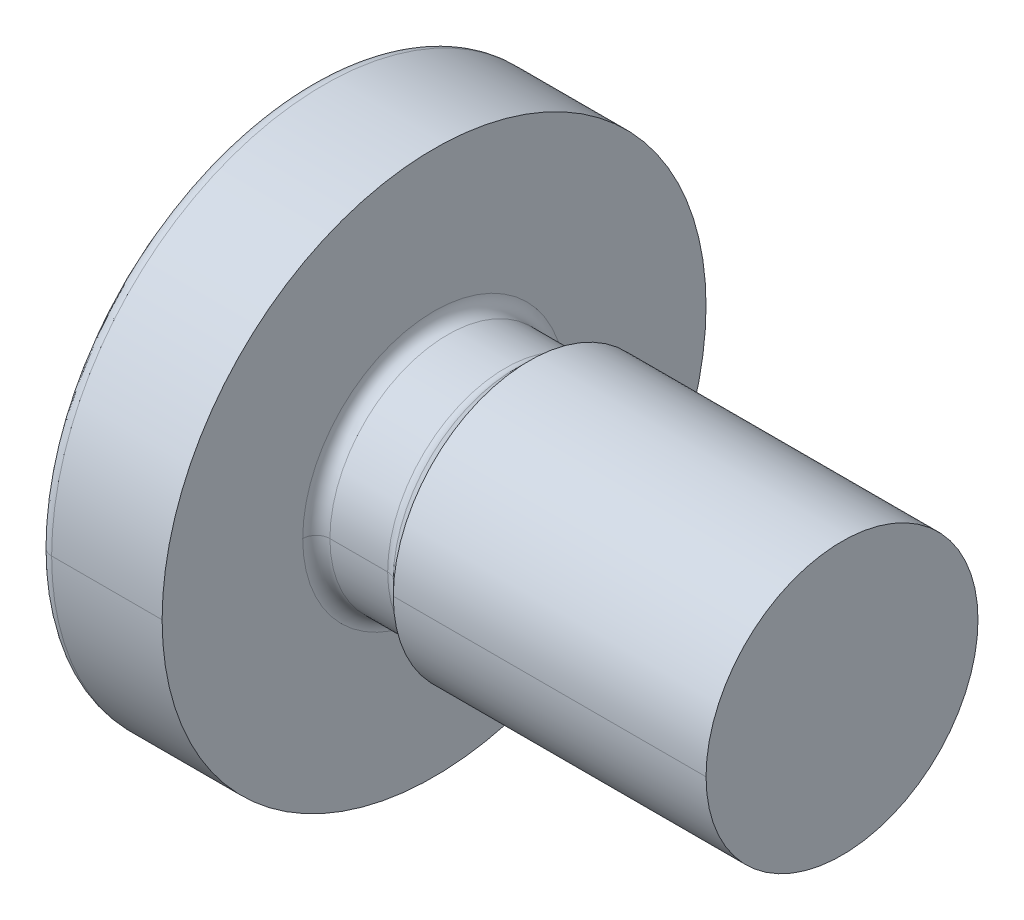
ISO-10303-21;
HEADER;
FILE_DESCRIPTION(('STEP AP214'),'2;1');
FILE_NAME('part.step','',(''),(''),'','','');
FILE_SCHEMA(('AUTOMOTIVE_DESIGN { 1 0 10303 214 1 1 1 1 }'));
ENDSEC;
DATA;
#1=APPLICATION_CONTEXT('core data for automotive mechanical design processes');
#2=APPLICATION_PROTOCOL_DEFINITION('international standard','automotive_design',2000,#1);
#3=PRODUCT_CONTEXT('',#1,'mechanical');
#4=PRODUCT('Part','Part','',(#3));
#5=PRODUCT_RELATED_PRODUCT_CATEGORY('part','',(#4));
#6=PRODUCT_DEFINITION_FORMATION('','',#4);
#7=PRODUCT_DEFINITION_CONTEXT('part definition',#1,'design');
#8=PRODUCT_DEFINITION('design','',#6,#7);
#9=PRODUCT_DEFINITION_SHAPE('','',#8);
#10=(LENGTH_UNIT() NAMED_UNIT(*) SI_UNIT(.MILLI.,.METRE.));
#11=(NAMED_UNIT(*) PLANE_ANGLE_UNIT() SI_UNIT($,.RADIAN.));
#12=(NAMED_UNIT(*) SI_UNIT($,.STERADIAN.) SOLID_ANGLE_UNIT());
#13=UNCERTAINTY_MEASURE_WITH_UNIT(LENGTH_MEASURE(1.E-05),#10,'distance_accuracy_value','');
#14=(GEOMETRIC_REPRESENTATION_CONTEXT(3) GLOBAL_UNCERTAINTY_ASSIGNED_CONTEXT((#13)) GLOBAL_UNIT_ASSIGNED_CONTEXT((#10,
#11,#12)) REPRESENTATION_CONTEXT('',''));
#15=CARTESIAN_POINT('',(0.,0.,0.));
#16=DIRECTION('',(0.,0.,1.));
#17=DIRECTION('',(1.,0.,0.));
#18=AXIS2_PLACEMENT_3D('',#15,#16,#17);
#19=CARTESIAN_POINT('',(3.3,0.,0.));
#20=DIRECTION('',(-1.,0.,0.));
#21=DIRECTION('',(0.,0.,1.));
#22=AXIS2_PLACEMENT_3D('',#19,#20,#21);
#23=TOROIDAL_SURFACE('',#22,1.932,0.2);
#24=CARTESIAN_POINT('',(3.1,0.,0.));
#25=DIRECTION('',(-1.,0.,0.));
#26=DIRECTION('',(0.,0.,1.));
#27=AXIS2_PLACEMENT_3D('',#24,#25,#26);
#28=CIRCLE('',#27,1.932);
#29=CARTESIAN_POINT('',(3.1,0.,-1.932));
#30=VERTEX_POINT('',#29);
#31=CARTESIAN_POINT('',(3.1,0.,1.932));
#32=VERTEX_POINT('',#31);
#33=EDGE_CURVE('E40',#30,#32,#28,.T.);
#34=ORIENTED_EDGE('',*,*,#33,.F.);
#35=CARTESIAN_POINT('',(3.3,0.,-1.932));
#36=DIRECTION('',(0.,1.,0.));
#37=DIRECTION('',(0.,0.,1.));
#38=AXIS2_PLACEMENT_3D('',#35,#36,#37);
#39=CIRCLE('',#38,0.2);
#40=CARTESIAN_POINT('',(3.3,0.,-1.732));
#41=VERTEX_POINT('',#40);
#42=EDGE_CURVE('E10',#30,#41,#39,.T.);
#43=ORIENTED_EDGE('',*,*,#42,.T.);
#44=CARTESIAN_POINT('',(3.3,0.,0.));
#45=DIRECTION('',(1.,0.,0.));
#46=DIRECTION('',(0.,0.,1.));
#47=AXIS2_PLACEMENT_3D('',#44,#45,#46);
#48=CIRCLE('',#47,1.732);
#49=CARTESIAN_POINT('',(3.3,0.,1.732));
#50=VERTEX_POINT('',#49);
#51=EDGE_CURVE('E386',#50,#41,#48,.T.);
#52=ORIENTED_EDGE('',*,*,#51,.F.);
#53=CARTESIAN_POINT('',(3.3,0.,1.932));
#54=DIRECTION('',(0.,-1.,0.));
#55=DIRECTION('',(0.,0.,-1.));
#56=AXIS2_PLACEMENT_3D('',#53,#54,#55);
#57=CIRCLE('',#56,0.2);
#58=EDGE_CURVE('E421',#32,#50,#57,.T.);
#59=ORIENTED_EDGE('',*,*,#58,.F.);
#60=EDGE_LOOP('',(#34,#43,#52,#59));
#61=FACE_BOUND('',#60,.T.);
#62=ADVANCED_FACE('F15',(#61),#23,.F.);
#63=CARTESIAN_POINT('',(4.14915728752538,0.,0.));
#64=DIRECTION('',(-1.,0.,0.));
#65=DIRECTION('',(0.,0.,1.));
#66=AXIS2_PLACEMENT_3D('',#63,#64,#65);
#67=TOROIDAL_SURFACE('',#66,1.932,0.2);
#68=CARTESIAN_POINT('',(4.14915728752538,0.,0.));
#69=DIRECTION('',(-1.,0.,0.));
#70=DIRECTION('',(0.,0.,1.));
#71=AXIS2_PLACEMENT_3D('',#68,#69,#70);
#72=CIRCLE('',#71,1.732);
#73=CARTESIAN_POINT('',(4.14915728752538,0.,-1.732));
#74=VERTEX_POINT('',#73);
#75=CARTESIAN_POINT('',(4.14915728752538,0.,1.732));
#76=VERTEX_POINT('',#75);
#77=EDGE_CURVE('E424',#74,#76,#72,.T.);
#78=ORIENTED_EDGE('',*,*,#77,.F.);
#79=CARTESIAN_POINT('',(4.14915728752538,0.,-1.932));
#80=DIRECTION('',(0.,1.,0.));
#81=DIRECTION('',(0.,0.,1.));
#82=AXIS2_PLACEMENT_3D('',#79,#80,#81);
#83=CIRCLE('',#82,0.2);
#84=CARTESIAN_POINT('',(4.29057864376269,0.,-1.79057864376269));
#85=VERTEX_POINT('',#84);
#86=EDGE_CURVE('E26',#74,#85,#83,.T.);
#87=ORIENTED_EDGE('',*,*,#86,.T.);
#88=CARTESIAN_POINT('',(4.29057864376269,0.,0.));
#89=DIRECTION('',(1.,0.,0.));
#90=DIRECTION('',(0.,0.,-1.));
#91=AXIS2_PLACEMENT_3D('',#88,#89,#90);
#92=CIRCLE('',#91,1.79057864376269);
#93=CARTESIAN_POINT('',(4.29057864376269,0.,1.79057864376269));
#94=VERTEX_POINT('',#93);
#95=EDGE_CURVE('E383',#94,#85,#92,.T.);
#96=ORIENTED_EDGE('',*,*,#95,.F.);
#97=CARTESIAN_POINT('',(4.14915728752538,0.,1.932));
#98=DIRECTION('',(0.,-1.,0.));
#99=DIRECTION('',(0.,0.,-1.));
#100=AXIS2_PLACEMENT_3D('',#97,#98,#99);
#101=CIRCLE('',#100,0.2);
#102=EDGE_CURVE('E300',#76,#94,#101,.T.);
#103=ORIENTED_EDGE('',*,*,#102,.F.);
#104=EDGE_LOOP('',(#78,#87,#96,#103));
#105=FACE_BOUND('',#104,.T.);
#106=ADVANCED_FACE('F685',(#105),#67,.F.);
#107=CARTESIAN_POINT('',(1.47506218943955,0.,0.));
#108=DIRECTION('',(1.,0.,0.));
#109=DIRECTION('',(0.,0.,-1.));
#110=AXIS2_PLACEMENT_3D('',#107,#108,#109);
#111=TOROIDAL_SURFACE('',#110,3.8,0.2);
#112=CARTESIAN_POINT('',(1.31554035418367,0.,0.));
#113=DIRECTION('',(-1.,0.,0.));
#114=DIRECTION('',(0.,0.,-1.));
#115=AXIS2_PLACEMENT_3D('',#112,#113,#114);
#116=CIRCLE('',#115,3.92063492063492);
#117=CARTESIAN_POINT('',(1.31554035418367,0.,3.92063492063492));
#118=VERTEX_POINT('',#117);
#119=CARTESIAN_POINT('',(1.31554035418367,3.92063492063492,0.));
#120=VERTEX_POINT('',#119);
#121=EDGE_CURVE('E340',#118,#120,#116,.T.);
#122=ORIENTED_EDGE('',*,*,#121,.F.);
#123=CARTESIAN_POINT('',(1.47506218943955,0.,3.8));
#124=DIRECTION('',(0.,1.,0.));
#125=DIRECTION('',(0.,0.,1.));
#126=AXIS2_PLACEMENT_3D('',#123,#124,#125);
#127=CIRCLE('',#126,0.2);
#128=CARTESIAN_POINT('',(1.47506218943955,0.,4.));
#129=VERTEX_POINT('',#128);
#130=EDGE_CURVE('E501',#118,#129,#127,.T.);
#131=ORIENTED_EDGE('',*,*,#130,.T.);
#132=CARTESIAN_POINT('',(1.47506218943955,0.,0.));
#133=DIRECTION('',(1.,0.,0.));
#134=DIRECTION('',(0.,0.,-1.));
#135=AXIS2_PLACEMENT_3D('',#132,#133,#134);
#136=CIRCLE('',#135,4.);
#137=CARTESIAN_POINT('',(1.47506218943955,0.,-4.));
#138=VERTEX_POINT('',#137);
#139=EDGE_CURVE('E260',#138,#129,#136,.T.);
#140=ORIENTED_EDGE('',*,*,#139,.F.);
#141=CARTESIAN_POINT('',(1.47506218943955,0.,-3.8));
#142=DIRECTION('',(0.,-1.,0.));
#143=DIRECTION('',(0.,0.,-1.));
#144=AXIS2_PLACEMENT_3D('',#141,#142,#143);
#145=CIRCLE('',#144,0.2);
#146=CARTESIAN_POINT('',(1.31554035418367,0.,-3.92063492063492));
#147=VERTEX_POINT('',#146);
#148=EDGE_CURVE('E296',#147,#138,#145,.T.);
#149=ORIENTED_EDGE('',*,*,#148,.F.);
#150=CARTESIAN_POINT('',(1.31554035418367,0.,0.));
#151=DIRECTION('',(-1.,0.,0.));
#152=DIRECTION('',(0.,0.,-1.));
#153=AXIS2_PLACEMENT_3D('',#150,#151,#152);
#154=CIRCLE('',#153,3.92063492063492);
#155=EDGE_CURVE('E467',#120,#147,#154,.T.);
#156=ORIENTED_EDGE('',*,*,#155,.F.);
#157=EDGE_LOOP('',(#122,#131,#140,#149,#156));
#158=FACE_BOUND('',#157,.T.);
#159=ADVANCED_FACE('F648',(#158),#111,.T.);
#160=CARTESIAN_POINT('',(-3.4420013783492,0.,0.));
#161=DIRECTION('',(-1.,0.,0.));
#162=DIRECTION('',(0.,0.,1.));
#163=AXIS2_PLACEMENT_3D('',#160,#161,#162);
#164=CYLINDRICAL_SURFACE('',#163,2.);
#165=CARTESIAN_POINT('',(9.1,0.,0.));
#166=DIRECTION('',(-1.,0.,0.));
#167=DIRECTION('',(0.,0.,1.));
#168=AXIS2_PLACEMENT_3D('',#165,#166,#167);
#169=CIRCLE('',#168,2.);
#170=CARTESIAN_POINT('',(9.1,0.,2.));
#171=VERTEX_POINT('',#170);
#172=CARTESIAN_POINT('',(9.1,0.,-2.));
#173=VERTEX_POINT('',#172);
#174=EDGE_CURVE('E400',#171,#173,#169,.T.);
#175=ORIENTED_EDGE('',*,*,#174,.T.);
#176=DIRECTION('',(-1.,0.,0.));
#177=VECTOR('',#176,1.);
#178=CARTESIAN_POINT('',(-3.4420013783492,0.,-2.));
#179=LINE('',#178,#177);
#180=CARTESIAN_POINT('',(4.5,0.,-2.));
#181=VERTEX_POINT('',#180);
#182=EDGE_CURVE('E396',#173,#181,#179,.T.);
#183=ORIENTED_EDGE('',*,*,#182,.T.);
#184=CARTESIAN_POINT('',(4.5,0.,0.));
#185=DIRECTION('',(-1.,0.,0.));
#186=DIRECTION('',(0.,0.,1.));
#187=AXIS2_PLACEMENT_3D('',#184,#185,#186);
#188=CIRCLE('',#187,2.);
#189=CARTESIAN_POINT('',(4.5,0.,2.));
#190=VERTEX_POINT('',#189);
#191=EDGE_CURVE('E455',#190,#181,#188,.T.);
#192=ORIENTED_EDGE('',*,*,#191,.F.);
#193=DIRECTION('',(-1.,0.,0.));
#194=VECTOR('',#193,1.);
#195=CARTESIAN_POINT('',(-3.4420013783492,0.,2.));
#196=LINE('',#195,#194);
#197=EDGE_CURVE('E299',#171,#190,#196,.T.);
#198=ORIENTED_EDGE('',*,*,#197,.F.);
#199=EDGE_LOOP('',(#175,#183,#192,#198));
#200=FACE_BOUND('',#199,.T.);
#201=ADVANCED_FACE('F697',(#200),#164,.T.);
#202=CARTESIAN_POINT('',(4.5,0.,0.));
#203=DIRECTION('',(1.,0.,0.));
#204=DIRECTION('',(0.,0.,-1.));
#205=AXIS2_PLACEMENT_3D('',#202,#203,#204);
#206=CONICAL_SURFACE('',#205,2.,0.785398163397442);
#207=CARTESIAN_POINT('',(4.29057864376269,0.,0.));
#208=DIRECTION('',(1.,0.,0.));
#209=DIRECTION('',(0.,0.,-1.));
#210=AXIS2_PLACEMENT_3D('',#207,#208,#209);
#211=CIRCLE('',#210,1.79057864376269);
#212=EDGE_CURVE('E19',#85,#94,#211,.T.);
#213=ORIENTED_EDGE('',*,*,#212,.T.);
#214=DIRECTION('',(0.707106781186552,0.,0.707106781186544));
#215=VECTOR('',#214,1.);
#216=CARTESIAN_POINT('',(4.5,0.,2.));
#217=LINE('',#216,#215);
#218=EDGE_CURVE('E451',#94,#190,#217,.T.);
#219=ORIENTED_EDGE('',*,*,#218,.T.);
#220=ORIENTED_EDGE('',*,*,#191,.T.);
#221=DIRECTION('',(0.707106781186552,0.,-0.707106781186544));
#222=VECTOR('',#221,1.);
#223=CARTESIAN_POINT('',(4.5,0.,-2.));
#224=LINE('',#223,#222);
#225=EDGE_CURVE('E361',#85,#181,#224,.T.);
#226=ORIENTED_EDGE('',*,*,#225,.F.);
#227=EDGE_LOOP('',(#213,#219,#220,#226));
#228=FACE_BOUND('',#227,.T.);
#229=ADVANCED_FACE('F17',(#228),#206,.T.);
#230=CARTESIAN_POINT('',(-3.4420013783492,0.,0.));
#231=DIRECTION('',(-1.,0.,0.));
#232=DIRECTION('',(0.,0.,1.));
#233=AXIS2_PLACEMENT_3D('',#230,#231,#232);
#234=CYLINDRICAL_SURFACE('',#233,1.732);
#235=CARTESIAN_POINT('',(4.14915728752538,0.,0.));
#236=DIRECTION('',(-1.,0.,0.));
#237=DIRECTION('',(0.,0.,1.));
#238=AXIS2_PLACEMENT_3D('',#235,#236,#237);
#239=CIRCLE('',#238,1.732);
#240=EDGE_CURVE('E459',#76,#74,#239,.T.);
#241=ORIENTED_EDGE('',*,*,#240,.T.);
#242=DIRECTION('',(-1.,0.,0.));
#243=VECTOR('',#242,1.);
#244=CARTESIAN_POINT('',(-3.4420013783492,0.,-1.732));
#245=LINE('',#244,#243);
#246=EDGE_CURVE('E366',#74,#41,#245,.T.);
#247=ORIENTED_EDGE('',*,*,#246,.T.);
#248=CARTESIAN_POINT('',(3.3,0.,0.));
#249=DIRECTION('',(1.,0.,0.));
#250=DIRECTION('',(0.,0.,1.));
#251=AXIS2_PLACEMENT_3D('',#248,#249,#250);
#252=CIRCLE('',#251,1.732);
#253=EDGE_CURVE('E273',#41,#50,#252,.T.);
#254=ORIENTED_EDGE('',*,*,#253,.T.);
#255=DIRECTION('',(-1.,0.,0.));
#256=VECTOR('',#255,1.);
#257=CARTESIAN_POINT('',(-3.4420013783492,0.,1.732));
#258=LINE('',#257,#256);
#259=EDGE_CURVE('E436',#76,#50,#258,.T.);
#260=ORIENTED_EDGE('',*,*,#259,.F.);
#261=EDGE_LOOP('',(#241,#247,#254,#260));
#262=FACE_BOUND('',#261,.T.);
#263=ADVANCED_FACE('F720',(#262),#234,.T.);
#264=CARTESIAN_POINT('',(-3.4420013783492,0.,0.));
#265=DIRECTION('',(-1.,0.,0.));
#266=DIRECTION('',(0.,0.,1.));
#267=AXIS2_PLACEMENT_3D('',#264,#265,#266);
#268=CYLINDRICAL_SURFACE('',#267,4.);
#269=CARTESIAN_POINT('',(3.1,0.,0.));
#270=DIRECTION('',(-1.,0.,0.));
#271=DIRECTION('',(0.,0.,1.));
#272=AXIS2_PLACEMENT_3D('',#269,#270,#271);
#273=CIRCLE('',#272,4.);
#274=CARTESIAN_POINT('',(3.1,0.,4.));
#275=VERTEX_POINT('',#274);
#276=CARTESIAN_POINT('',(3.1,0.,-4.));
#277=VERTEX_POINT('',#276);
#278=EDGE_CURVE('E257',#275,#277,#273,.T.);
#279=ORIENTED_EDGE('',*,*,#278,.T.);
#280=DIRECTION('',(-1.,0.,0.));
#281=VECTOR('',#280,1.);
#282=CARTESIAN_POINT('',(-3.4420013783492,0.,-4.));
#283=LINE('',#282,#281);
#284=EDGE_CURVE('E274',#277,#138,#283,.T.);
#285=ORIENTED_EDGE('',*,*,#284,.T.);
#286=ORIENTED_EDGE('',*,*,#139,.T.);
#287=DIRECTION('',(-1.,0.,0.));
#288=VECTOR('',#287,1.);
#289=CARTESIAN_POINT('',(-3.4420013783492,0.,4.));
#290=LINE('',#289,#288);
#291=EDGE_CURVE('E253',#275,#129,#290,.T.);
#292=ORIENTED_EDGE('',*,*,#291,.F.);
#293=EDGE_LOOP('',(#279,#285,#286,#292));
#294=FACE_BOUND('',#293,.T.);
#295=ADVANCED_FACE('F255',(#294),#268,.T.);
#296=CARTESIAN_POINT('',(6.5,0.,0.));
#297=DIRECTION('',(0.,0.,-1.));
#298=DIRECTION('',(0.,1.,0.));
#299=AXIS2_PLACEMENT_3D('',#296,#297,#298);
#300=SPHERICAL_SURFACE('',#299,6.5);
#301=ORIENTED_EDGE('',*,*,#155,.T.);
#302=CARTESIAN_POINT('',(1.31554035418367,0.,0.));
#303=DIRECTION('',(-1.,0.,0.));
#304=DIRECTION('',(0.,0.,-1.));
#305=AXIS2_PLACEMENT_3D('',#302,#303,#304);
#306=CIRCLE('',#305,3.92063492063492);
#307=CARTESIAN_POINT('',(1.31554035418367,-3.92063492063492,0.));
#308=VERTEX_POINT('',#307);
#309=EDGE_CURVE('E382',#147,#308,#306,.T.);
#310=ORIENTED_EDGE('',*,*,#309,.T.);
#311=CARTESIAN_POINT('',(6.5,0.,0.));
#312=DIRECTION('',(0.,0.,-1.));
#313=DIRECTION('',(0.,1.,0.));
#314=AXIS2_PLACEMENT_3D('',#311,#312,#313);
#315=CIRCLE('',#314,6.5);
#316=CARTESIAN_POINT('',(0.0700305769772273,-0.951574074359006,0.));
#317=VERTEX_POINT('',#316);
#318=EDGE_CURVE('E329',#308,#317,#315,.T.);
#319=ORIENTED_EDGE('',*,*,#318,.T.);
#320=CARTESIAN_POINT('',(6.52789360657738,-0.29236017383838,0.112226556013255));
#321=DIRECTION('',(0.0887201386737616,-0.929898939158985,0.356954758960717));
#322=DIRECTION('',(0.,-0.358367949545297,-0.933580426497203));
#323=AXIS2_PLACEMENT_3D('',#320,#321,#322);
#324=CIRCLE('',#323,6.49239190711641);
#325=CARTESIAN_POINT('',(0.141888285622446,-1.1900033192439,-0.638989457439411));
#326=VERTEX_POINT('',#325);
#327=EDGE_CURVE('E325',#317,#326,#324,.T.);
#328=ORIENTED_EDGE('',*,*,#327,.T.);
#329=CARTESIAN_POINT('',(6.49834511100712,0.0173453236425432,-0.0167501843369997));
#330=DIRECTION('',(0.068469970377108,-0.717651637719428,0.693028130767562));
#331=DIRECTION('',(0.,-0.694658370458996,-0.719339800338652));
#332=AXIS2_PLACEMENT_3D('',#329,#330,#331);
#333=CIRCLE('',#332,6.49995506387658);
#334=CARTESIAN_POINT('',(0.368688551321992,-1.75882202008378,-1.25042593582281));
#335=VERTEX_POINT('',#334);
#336=EDGE_CURVE('E330',#326,#335,#333,.T.);
#337=ORIENTED_EDGE('',*,*,#336,.T.);
#338=CARTESIAN_POINT('',(6.12899407355305,0.526174253500918,0.526174253500918));
#339=DIRECTION('',(-0.446197814505031,0.632814155313759,0.63281415531376));
#340=DIRECTION('',(0.,-0.707106781186548,0.707106781186547));
#341=AXIS2_PLACEMENT_3D('',#338,#339,#340);
#342=CIRCLE('',#341,6.44659878637152);
#343=CARTESIAN_POINT('',(0.368688551617876,-1.25042593573104,-1.75882201996693));
#344=VERTEX_POINT('',#343);
#345=EDGE_CURVE('E323',#344,#335,#342,.T.);
#346=ORIENTED_EDGE('',*,*,#345,.F.);
#347=CARTESIAN_POINT('',(6.49834511100712,-0.0167501843369965,0.0173453236425399));
#348=DIRECTION('',(0.0684699703771074,0.693028130767562,-0.717651637719428));
#349=DIRECTION('',(0.,0.719339800338653,0.694658370458996));
#350=AXIS2_PLACEMENT_3D('',#347,#348,#349);
#351=CIRCLE('',#350,6.49995506387658);
#352=CARTESIAN_POINT('',(0.14188828559706,-0.638989457439412,-1.19000331924632));
#353=VERTEX_POINT('',#352);
#354=EDGE_CURVE('E312',#344,#353,#351,.T.);
#355=ORIENTED_EDGE('',*,*,#354,.T.);
#356=CARTESIAN_POINT('',(6.52789360657738,0.112226556013256,-0.292360173838383));
#357=DIRECTION('',(0.088720138673761,0.356954758960716,-0.929898939158985));
#358=DIRECTION('',(0.,0.933580426497203,0.358367949545296));
#359=AXIS2_PLACEMENT_3D('',#356,#357,#358);
#360=CIRCLE('',#359,6.49239190711641);
#361=CARTESIAN_POINT('',(0.0700305769772278,0.,-0.951574074359006));
#362=VERTEX_POINT('',#361);
#363=EDGE_CURVE('E308',#353,#362,#360,.T.);
#364=ORIENTED_EDGE('',*,*,#363,.T.);
#365=CARTESIAN_POINT('',(6.52789360657738,-0.112226556013256,-0.292360173838381));
#366=DIRECTION('',(0.0887201386737613,-0.356954758960717,-0.929898939158985));
#367=DIRECTION('',(0.,0.933580426497203,-0.358367949545297));
#368=AXIS2_PLACEMENT_3D('',#365,#366,#367);
#369=CIRCLE('',#368,6.49239190711642);
#370=CARTESIAN_POINT('',(0.141888285622446,0.638989457439412,-1.1900033192439));
#371=VERTEX_POINT('',#370);
#372=EDGE_CURVE('E313',#362,#371,#369,.T.);
#373=ORIENTED_EDGE('',*,*,#372,.T.);
#374=CARTESIAN_POINT('',(6.49834511100712,0.0167501843369982,0.0173453236425417));
#375=DIRECTION('',(0.0684699703771077,-0.693028130767562,-0.717651637719428));
#376=DIRECTION('',(0.,0.719339800338653,-0.694658370458996));
#377=AXIS2_PLACEMENT_3D('',#374,#375,#376);
#378=CIRCLE('',#377,6.49995506387658);
#379=CARTESIAN_POINT('',(0.368688551321989,1.25042593582281,-1.75882202008378));
#380=VERTEX_POINT('',#379);
#381=EDGE_CURVE('E350',#371,#380,#378,.T.);
#382=ORIENTED_EDGE('',*,*,#381,.T.);
#383=CARTESIAN_POINT('',(6.12899407355305,-0.526174253500918,0.526174253500918));
#384=DIRECTION('',(-0.446197814505031,-0.63281415531376,0.63281415531376));
#385=DIRECTION('',(0.,-0.707106781186548,-0.707106781186548));
#386=AXIS2_PLACEMENT_3D('',#383,#384,#385);
#387=CIRCLE('',#386,6.44659878637152);
#388=CARTESIAN_POINT('',(0.368688551321991,1.75882202008378,-1.25042593582281));
#389=VERTEX_POINT('',#388);
#390=EDGE_CURVE('E346',#389,#380,#387,.T.);
#391=ORIENTED_EDGE('',*,*,#390,.F.);
#392=CARTESIAN_POINT('',(6.49834511100712,-0.0173453236425419,-0.0167501843369984));
#393=DIRECTION('',(0.0684699703771078,0.717651637719428,0.693028130767562));
#394=DIRECTION('',(0.,-0.694658370458996,0.719339800338652));
#395=AXIS2_PLACEMENT_3D('',#392,#393,#394);
#396=CIRCLE('',#395,6.49995506387658);
#397=CARTESIAN_POINT('',(0.141888285597059,1.19000331924632,-0.638989457439412));
#398=VERTEX_POINT('',#397);
#399=EDGE_CURVE('E288',#389,#398,#396,.T.);
#400=ORIENTED_EDGE('',*,*,#399,.T.);
#401=CARTESIAN_POINT('',(6.52789360657738,0.292360173838381,0.112226556013255));
#402=DIRECTION('',(0.0887201386737615,0.929898939158985,0.356954758960717));
#403=DIRECTION('',(0.,-0.358367949545297,0.933580426497203));
#404=AXIS2_PLACEMENT_3D('',#401,#402,#403);
#405=CIRCLE('',#404,6.49239190711641);
#406=CARTESIAN_POINT('',(0.0700305769772273,0.951574074359006,0.));
#407=VERTEX_POINT('',#406);
#408=EDGE_CURVE('E339',#398,#407,#405,.T.);
#409=ORIENTED_EDGE('',*,*,#408,.T.);
#410=CARTESIAN_POINT('',(6.5,0.,0.));
#411=DIRECTION('',(0.,0.,1.));
#412=DIRECTION('',(1.,0.,0.));
#413=AXIS2_PLACEMENT_3D('',#410,#411,#412);
#414=CIRCLE('',#413,6.5);
#415=EDGE_CURVE('E392',#120,#407,#414,.T.);
#416=ORIENTED_EDGE('',*,*,#415,.F.);
#417=EDGE_LOOP('',(#301,#310,#319,#328,#337,#346,#355,#364,#373,#382,#391,#400,#409,#416));
#418=FACE_BOUND('',#417,.T.);
#419=ADVANCED_FACE('F511',(#418),#300,.T.);
#420=CARTESIAN_POINT('',(6.5,0.,0.));
#421=DIRECTION('',(0.,0.,-1.));
#422=DIRECTION('',(0.,1.,0.));
#423=AXIS2_PLACEMENT_3D('',#420,#421,#422);
#424=SPHERICAL_SURFACE('',#423,6.5);
#425=ORIENTED_EDGE('',*,*,#318,.F.);
#426=CARTESIAN_POINT('',(1.31554035418367,0.,0.));
#427=DIRECTION('',(-1.,0.,0.));
#428=DIRECTION('',(0.,0.,-1.));
#429=AXIS2_PLACEMENT_3D('',#426,#427,#428);
#430=CIRCLE('',#429,3.92063492063492);
#431=EDGE_CURVE('E335',#308,#118,#430,.T.);
#432=ORIENTED_EDGE('',*,*,#431,.T.);
#433=ORIENTED_EDGE('',*,*,#121,.T.);
#434=ORIENTED_EDGE('',*,*,#415,.T.);
#435=CARTESIAN_POINT('',(6.52789360657738,0.292360173838381,-0.112226556013255));
#436=DIRECTION('',(0.0887201386737615,0.929898939158985,-0.356954758960717));
#437=DIRECTION('',(0.,0.358367949545297,0.933580426497203));
#438=AXIS2_PLACEMENT_3D('',#435,#436,#437);
#439=CIRCLE('',#438,6.49239190711641);
#440=CARTESIAN_POINT('',(0.141888285622446,1.1900033192439,0.638989457439412));
#441=VERTEX_POINT('',#440);
#442=EDGE_CURVE('E414',#407,#441,#439,.T.);
#443=ORIENTED_EDGE('',*,*,#442,.T.);
#444=CARTESIAN_POINT('',(6.49834511100712,-0.0173453236425423,0.0167501843369988));
#445=DIRECTION('',(0.0684699703771079,0.717651637719428,-0.693028130767562));
#446=DIRECTION('',(0.,0.694658370458996,0.719339800338652));
#447=AXIS2_PLACEMENT_3D('',#444,#445,#446);
#448=CIRCLE('',#447,6.49995506387658);
#449=CARTESIAN_POINT('',(0.368688551321991,1.75882202008378,1.25042593582281));
#450=VERTEX_POINT('',#449);
#451=EDGE_CURVE('E418',#441,#450,#448,.T.);
#452=ORIENTED_EDGE('',*,*,#451,.T.);
#453=CARTESIAN_POINT('',(6.12899407355305,-0.526174253500918,-0.526174253500918));
#454=DIRECTION('',(-0.446197814505031,-0.63281415531376,-0.63281415531376));
#455=DIRECTION('',(0.,0.707106781186548,-0.707106781186548));
#456=AXIS2_PLACEMENT_3D('',#453,#454,#455);
#457=CIRCLE('',#456,6.44659878637152);
#458=CARTESIAN_POINT('',(0.368688551617876,1.25042593573104,1.75882201996693));
#459=VERTEX_POINT('',#458);
#460=EDGE_CURVE('E371',#459,#450,#457,.T.);
#461=ORIENTED_EDGE('',*,*,#460,.F.);
#462=CARTESIAN_POINT('',(6.49834511100712,0.0167501843369981,-0.0173453236425416));
#463=DIRECTION('',(0.0684699703771077,-0.693028130767562,0.717651637719428));
#464=DIRECTION('',(0.,-0.719339800338653,-0.694658370458996));
#465=AXIS2_PLACEMENT_3D('',#462,#463,#464);
#466=CIRCLE('',#465,6.49995506387658);
#467=CARTESIAN_POINT('',(0.141888285597059,0.638989457439412,1.19000331924632));
#468=VERTEX_POINT('',#467);
#469=EDGE_CURVE('E555',#459,#468,#466,.T.);
#470=ORIENTED_EDGE('',*,*,#469,.T.);
#471=CARTESIAN_POINT('',(6.52789360657738,-0.112226556013256,0.292360173838381));
#472=DIRECTION('',(0.0887201386737613,-0.356954758960717,0.929898939158985));
#473=DIRECTION('',(0.,-0.933580426497203,-0.358367949545297));
#474=AXIS2_PLACEMENT_3D('',#471,#472,#473);
#475=CIRCLE('',#474,6.49239190711642);
#476=CARTESIAN_POINT('',(0.0700305769772286,0.,0.951574074359006));
#477=VERTEX_POINT('',#476);
#478=EDGE_CURVE('E225',#468,#477,#475,.T.);
#479=ORIENTED_EDGE('',*,*,#478,.T.);
#480=CARTESIAN_POINT('',(6.52789360657738,0.112226556013256,0.292360173838383));
#481=DIRECTION('',(0.088720138673761,0.356954758960716,0.929898939158985));
#482=DIRECTION('',(0.,-0.933580426497203,0.358367949545296));
#483=AXIS2_PLACEMENT_3D('',#480,#481,#482);
#484=CIRCLE('',#483,6.49239190711641);
#485=CARTESIAN_POINT('',(0.141888285622446,-0.638989457439412,1.1900033192439));
#486=VERTEX_POINT('',#485);
#487=EDGE_CURVE('E213',#477,#486,#484,.T.);
#488=ORIENTED_EDGE('',*,*,#487,.T.);
#489=CARTESIAN_POINT('',(6.49834511100712,-0.0167501843369968,-0.0173453236425402));
#490=DIRECTION('',(0.0684699703771075,0.693028130767562,0.717651637719428));
#491=DIRECTION('',(0.,-0.719339800338653,0.694658370458996));
#492=AXIS2_PLACEMENT_3D('',#489,#490,#491);
#493=CIRCLE('',#492,6.49995506387658);
#494=CARTESIAN_POINT('',(0.368688551321991,-1.25042593582281,1.75882202008378));
#495=VERTEX_POINT('',#494);
#496=EDGE_CURVE('E334',#486,#495,#493,.T.);
#497=ORIENTED_EDGE('',*,*,#496,.T.);
#498=CARTESIAN_POINT('',(6.12899407355305,0.526174253500918,-0.526174253500918));
#499=DIRECTION('',(-0.446197814505031,0.63281415531376,-0.63281415531376));
#500=DIRECTION('',(0.,0.707106781186548,0.707106781186547));
#501=AXIS2_PLACEMENT_3D('',#498,#499,#500);
#502=CIRCLE('',#501,6.44659878637152);
#503=CARTESIAN_POINT('',(0.368688551617876,-1.75882201996694,1.25042593573104));
#504=VERTEX_POINT('',#503);
#505=EDGE_CURVE('E319',#504,#495,#502,.T.);
#506=ORIENTED_EDGE('',*,*,#505,.F.);
#507=CARTESIAN_POINT('',(6.49834511100712,0.017345323642543,0.0167501843369996));
#508=DIRECTION('',(0.068469970377108,-0.717651637719428,-0.693028130767562));
#509=DIRECTION('',(0.,0.694658370458996,-0.719339800338652));
#510=AXIS2_PLACEMENT_3D('',#507,#508,#509);
#511=CIRCLE('',#510,6.49995506387658);
#512=CARTESIAN_POINT('',(0.141888285597059,-1.19000331924632,0.638989457439411));
#513=VERTEX_POINT('',#512);
#514=EDGE_CURVE('E284',#504,#513,#511,.T.);
#515=ORIENTED_EDGE('',*,*,#514,.T.);
#516=CARTESIAN_POINT('',(6.52789360657738,-0.29236017383838,-0.112226556013255));
#517=DIRECTION('',(0.0887201386737616,-0.929898939158985,-0.356954758960717));
#518=DIRECTION('',(0.,0.358367949545297,-0.933580426497203));
#519=AXIS2_PLACEMENT_3D('',#516,#517,#518);
#520=CIRCLE('',#519,6.49239190711642);
#521=EDGE_CURVE('E278',#513,#317,#520,.T.);
#522=ORIENTED_EDGE('',*,*,#521,.T.);
#523=EDGE_LOOP('',(#425,#432,#433,#434,#443,#452,#461,#470,#479,#488,#497,#506,#515,#522));
#524=FACE_BOUND('',#523,.T.);
#525=ADVANCED_FACE('F596',(#524),#424,.T.);
#526=CARTESIAN_POINT('',(-3.4420013783492,0.,0.));
#527=DIRECTION('',(-1.,0.,0.));
#528=DIRECTION('',(0.,0.,1.));
#529=AXIS2_PLACEMENT_3D('',#526,#527,#528);
#530=CYLINDRICAL_SURFACE('',#529,4.);
#531=ORIENTED_EDGE('',*,*,#284,.F.);
#532=CARTESIAN_POINT('',(3.1,0.,0.));
#533=DIRECTION('',(-1.,0.,0.));
#534=DIRECTION('',(0.,0.,1.));
#535=AXIS2_PLACEMENT_3D('',#532,#533,#534);
#536=CIRCLE('',#535,4.);
#537=EDGE_CURVE('E266',#277,#275,#536,.T.);
#538=ORIENTED_EDGE('',*,*,#537,.T.);
#539=ORIENTED_EDGE('',*,*,#291,.T.);
#540=CARTESIAN_POINT('',(1.47506218943955,0.,0.));
#541=DIRECTION('',(1.,0.,0.));
#542=DIRECTION('',(0.,0.,-1.));
#543=AXIS2_PLACEMENT_3D('',#540,#541,#542);
#544=CIRCLE('',#543,4.);
#545=EDGE_CURVE('E267',#129,#138,#544,.T.);
#546=ORIENTED_EDGE('',*,*,#545,.T.);
#547=EDGE_LOOP('',(#531,#538,#539,#546));
#548=FACE_BOUND('',#547,.T.);
#549=ADVANCED_FACE('F276',(#548),#530,.T.);
#550=CARTESIAN_POINT('',(3.1,4.,0.));
#551=DIRECTION('',(-1.,0.,0.));
#552=DIRECTION('',(0.,0.,1.));
#553=AXIS2_PLACEMENT_3D('',#550,#551,#552);
#554=PLANE('',#553);
#555=ORIENTED_EDGE('',*,*,#278,.F.);
#556=ORIENTED_EDGE('',*,*,#537,.F.);
#557=EDGE_LOOP('',(#555,#556));
#558=FACE_BOUND('',#557,.T.);
#559=CARTESIAN_POINT('',(3.1,0.,0.));
#560=DIRECTION('',(-1.,0.,0.));
#561=DIRECTION('',(0.,0.,1.));
#562=AXIS2_PLACEMENT_3D('',#559,#560,#561);
#563=CIRCLE('',#562,1.932);
#564=EDGE_CURVE('E401',#32,#30,#563,.T.);
#565=ORIENTED_EDGE('',*,*,#564,.T.);
#566=ORIENTED_EDGE('',*,*,#33,.T.);
#567=EDGE_LOOP('',(#565,#566));
#568=FACE_BOUND('',#567,.T.);
#569=ADVANCED_FACE('F270',(#558,#568),#554,.F.);
#570=CARTESIAN_POINT('',(-3.4420013783492,0.,0.));
#571=DIRECTION('',(-1.,0.,0.));
#572=DIRECTION('',(0.,0.,1.));
#573=AXIS2_PLACEMENT_3D('',#570,#571,#572);
#574=CYLINDRICAL_SURFACE('',#573,1.732);
#575=ORIENTED_EDGE('',*,*,#246,.F.);
#576=ORIENTED_EDGE('',*,*,#77,.T.);
#577=ORIENTED_EDGE('',*,*,#259,.T.);
#578=ORIENTED_EDGE('',*,*,#51,.T.);
#579=EDGE_LOOP('',(#575,#576,#577,#578));
#580=FACE_BOUND('',#579,.T.);
#581=ADVANCED_FACE('F733',(#580),#574,.T.);
#582=CARTESIAN_POINT('',(4.5,0.,0.));
#583=DIRECTION('',(1.,0.,0.));
#584=DIRECTION('',(0.,0.,-1.));
#585=AXIS2_PLACEMENT_3D('',#582,#583,#584);
#586=CONICAL_SURFACE('',#585,2.,0.785398163397442);
#587=ORIENTED_EDGE('',*,*,#218,.F.);
#588=ORIENTED_EDGE('',*,*,#95,.T.);
#589=ORIENTED_EDGE('',*,*,#225,.T.);
#590=CARTESIAN_POINT('',(4.5,0.,0.));
#591=DIRECTION('',(-1.,0.,0.));
#592=DIRECTION('',(0.,0.,1.));
#593=AXIS2_PLACEMENT_3D('',#590,#591,#592);
#594=CIRCLE('',#593,2.);
#595=EDGE_CURVE('E357',#181,#190,#594,.T.);
#596=ORIENTED_EDGE('',*,*,#595,.T.);
#597=EDGE_LOOP('',(#587,#588,#589,#596));
#598=FACE_BOUND('',#597,.T.);
#599=ADVANCED_FACE('F730',(#598),#586,.T.);
#600=CARTESIAN_POINT('',(-3.4420013783492,0.,0.));
#601=DIRECTION('',(-1.,0.,0.));
#602=DIRECTION('',(0.,0.,1.));
#603=AXIS2_PLACEMENT_3D('',#600,#601,#602);
#604=CYLINDRICAL_SURFACE('',#603,2.);
#605=ORIENTED_EDGE('',*,*,#182,.F.);
#606=CARTESIAN_POINT('',(9.1,0.,0.));
#607=DIRECTION('',(-1.,0.,0.));
#608=DIRECTION('',(0.,0.,1.));
#609=AXIS2_PLACEMENT_3D('',#606,#607,#608);
#610=CIRCLE('',#609,2.);
#611=EDGE_CURVE('E362',#173,#171,#610,.T.);
#612=ORIENTED_EDGE('',*,*,#611,.T.);
#613=ORIENTED_EDGE('',*,*,#197,.T.);
#614=ORIENTED_EDGE('',*,*,#595,.F.);
#615=EDGE_LOOP('',(#605,#612,#613,#614));
#616=FACE_BOUND('',#615,.T.);
#617=ADVANCED_FACE('F732',(#616),#604,.T.);
#618=CARTESIAN_POINT('',(9.1,0.,0.));
#619=DIRECTION('',(-1.,0.,0.));
#620=DIRECTION('',(0.,0.,1.));
#621=AXIS2_PLACEMENT_3D('',#618,#619,#620);
#622=PLANE('',#621);
#623=ORIENTED_EDGE('',*,*,#174,.F.);
#624=ORIENTED_EDGE('',*,*,#611,.F.);
#625=EDGE_LOOP('',(#623,#624));
#626=FACE_BOUND('',#625,.T.);
#627=ADVANCED_FACE('F845',(#626),#622,.F.);
#628=CARTESIAN_POINT('',(1.47506218943955,0.,0.));
#629=DIRECTION('',(1.,0.,0.));
#630=DIRECTION('',(0.,0.,-1.));
#631=AXIS2_PLACEMENT_3D('',#628,#629,#630);
#632=TOROIDAL_SURFACE('',#631,3.8,0.2);
#633=ORIENTED_EDGE('',*,*,#130,.F.);
#634=ORIENTED_EDGE('',*,*,#431,.F.);
#635=ORIENTED_EDGE('',*,*,#309,.F.);
#636=ORIENTED_EDGE('',*,*,#148,.T.);
#637=ORIENTED_EDGE('',*,*,#545,.F.);
#638=EDGE_LOOP('',(#633,#634,#635,#636,#637));
#639=FACE_BOUND('',#638,.T.);
#640=ADVANCED_FACE('F645',(#639),#632,.T.);
#641=CARTESIAN_POINT('',(4.14915728752538,0.,0.));
#642=DIRECTION('',(-1.,0.,0.));
#643=DIRECTION('',(0.,0.,1.));
#644=AXIS2_PLACEMENT_3D('',#641,#642,#643);
#645=TOROIDAL_SURFACE('',#644,1.932,0.2);
#646=ORIENTED_EDGE('',*,*,#86,.F.);
#647=ORIENTED_EDGE('',*,*,#240,.F.);
#648=ORIENTED_EDGE('',*,*,#102,.T.);
#649=ORIENTED_EDGE('',*,*,#212,.F.);
#650=EDGE_LOOP('',(#646,#647,#648,#649));
#651=FACE_BOUND('',#650,.T.);
#652=ADVANCED_FACE('F736',(#651),#645,.F.);
#653=CARTESIAN_POINT('',(3.3,0.,0.));
#654=DIRECTION('',(-1.,0.,0.));
#655=DIRECTION('',(0.,0.,1.));
#656=AXIS2_PLACEMENT_3D('',#653,#654,#655);
#657=TOROIDAL_SURFACE('',#656,1.932,0.2);
#658=ORIENTED_EDGE('',*,*,#42,.F.);
#659=ORIENTED_EDGE('',*,*,#564,.F.);
#660=ORIENTED_EDGE('',*,*,#58,.T.);
#661=ORIENTED_EDGE('',*,*,#253,.F.);
#662=EDGE_LOOP('',(#658,#659,#660,#661));
#663=FACE_BOUND('',#662,.T.);
#664=ADVANCED_FACE('F719',(#663),#657,.F.);
#665=CARTESIAN_POINT('',(0.,1.90442948354406,-1.36478109243278));
#666=DIRECTION('',(0.0684699703771078,0.717651637719428,0.693028130767562));
#667=DIRECTION('',(0.99515489379392,0.,-0.0983195675235249));
#668=AXIS2_PLACEMENT_3D('',#665,#666,#667);
#669=PLANE('',#668);
#670=DIRECTION('',(-0.893649599669889,0.352932172598372,-0.277180941904093));
#671=VECTOR('',#670,1.);
#672=CARTESIAN_POINT('',(1.17,1.44235727751092,-1.0018852749361));
#673=LINE('',#672,#671);
#674=CARTESIAN_POINT('',(2.34,0.980285071477781,-0.638989457439412));
#675=VERTEX_POINT('',#674);
#676=EDGE_CURVE('E295',#675,#389,#673,.T.);
#677=ORIENTED_EDGE('',*,*,#676,.F.);
#678=DIRECTION('',(0.995479460535586,-0.094977069083954,0.));
#679=VECTOR('',#678,1.);
#680=CARTESIAN_POINT('',(1.17,1.09191286012993,-0.638989457439412));
#681=LINE('',#680,#679);
#682=EDGE_CURVE('E345',#398,#675,#681,.T.);
#683=ORIENTED_EDGE('',*,*,#682,.F.);
#684=ORIENTED_EDGE('',*,*,#399,.F.);
#685=EDGE_LOOP('',(#677,#683,#684));
#686=FACE_BOUND('',#685,.T.);
#687=ADVANCED_FACE('F716',(#686),#669,.F.);
#688=CARTESIAN_POINT('',(0.,0.958255577304307,0.));
#689=DIRECTION('',(0.0887201386737615,0.929898939158985,0.356954758960717));
#690=DIRECTION('',(0.970473313784807,0.,-0.241208514011291));
#691=AXIS2_PLACEMENT_3D('',#688,#689,#690);
#692=PLANE('',#691);
#693=ORIENTED_EDGE('',*,*,#682,.T.);
#694=DIRECTION('',(0.,-0.358367949545297,0.933580426497203));
#695=VECTOR('',#694,1.);
#696=CARTESIAN_POINT('',(2.34,0.735,0.));
#697=LINE('',#696,#695);
#698=CARTESIAN_POINT('',(2.34,0.735,0.));
#699=VERTEX_POINT('',#698);
#700=EDGE_CURVE('E341',#675,#699,#697,.T.);
#701=ORIENTED_EDGE('',*,*,#700,.T.);
#702=DIRECTION('',(0.995479460535586,-0.0949770690839541,0.));
#703=VECTOR('',#702,1.);
#704=CARTESIAN_POINT('',(0.,0.958255577304307,0.));
#705=LINE('',#704,#703);
#706=EDGE_CURVE('E495',#407,#699,#705,.T.);
#707=ORIENTED_EDGE('',*,*,#706,.F.);
#708=ORIENTED_EDGE('',*,*,#408,.F.);
#709=EDGE_LOOP('',(#693,#701,#707,#708));
#710=FACE_BOUND('',#709,.T.);
#711=ADVANCED_FACE('F655',(#710),#692,.F.);
#712=CARTESIAN_POINT('',(2.34,0.980285071477781,-0.638989457439412));
#713=DIRECTION('',(-0.446197814505031,-0.63281415531376,0.63281415531376));
#714=DIRECTION('',(-0.817268653268361,0.576256842375793,0.));
#715=AXIS2_PLACEMENT_3D('',#712,#713,#714);
#716=PLANE('',#715);
#717=ORIENTED_EDGE('',*,*,#390,.T.);
#718=DIRECTION('',(0.893649599669889,-0.277180941904094,0.352932172598372));
#719=VECTOR('',#718,1.);
#720=CARTESIAN_POINT('',(1.17,1.0018852749361,-1.44235727751092));
#721=LINE('',#720,#719);
#722=CARTESIAN_POINT('',(2.34,0.638989457439411,-0.980285071477782));
#723=VERTEX_POINT('',#722);
#724=EDGE_CURVE('E294',#380,#723,#721,.T.);
#725=ORIENTED_EDGE('',*,*,#724,.T.);
#726=DIRECTION('',(0.,0.707106781186548,0.707106781186548));
#727=VECTOR('',#726,1.);
#728=CARTESIAN_POINT('',(2.34,0.980285071477781,-0.638989457439412));
#729=LINE('',#728,#727);
#730=EDGE_CURVE('E290',#723,#675,#729,.T.);
#731=ORIENTED_EDGE('',*,*,#730,.T.);
#732=ORIENTED_EDGE('',*,*,#676,.T.);
#733=EDGE_LOOP('',(#717,#725,#731,#732));
#734=FACE_BOUND('',#733,.T.);
#735=ADVANCED_FACE('F662',(#734),#716,.T.);
#736=CARTESIAN_POINT('',(0.,0.958255577304307,0.));
#737=DIRECTION('',(0.0887201386737615,0.929898939158985,-0.356954758960717));
#738=DIRECTION('',(-0.970473313784807,0.,-0.241208514011291));
#739=AXIS2_PLACEMENT_3D('',#736,#737,#738);
#740=PLANE('',#739);
#741=ORIENTED_EDGE('',*,*,#706,.T.);
#742=DIRECTION('',(0.,0.358367949545297,0.933580426497203));
#743=VECTOR('',#742,1.);
#744=CARTESIAN_POINT('',(2.34,0.735,0.));
#745=LINE('',#744,#743);
#746=CARTESIAN_POINT('',(2.34,0.980285071477781,0.638989457439412));
#747=VERTEX_POINT('',#746);
#748=EDGE_CURVE('E463',#699,#747,#745,.T.);
#749=ORIENTED_EDGE('',*,*,#748,.T.);
#750=DIRECTION('',(0.995479460535586,-0.0949770690839541,0.));
#751=VECTOR('',#750,1.);
#752=CARTESIAN_POINT('',(0.,1.20354064878209,0.638989457439412));
#753=LINE('',#752,#751);
#754=EDGE_CURVE('E374',#441,#747,#753,.T.);
#755=ORIENTED_EDGE('',*,*,#754,.F.);
#756=ORIENTED_EDGE('',*,*,#442,.F.);
#757=EDGE_LOOP('',(#741,#749,#755,#756));
#758=FACE_BOUND('',#757,.T.);
#759=ADVANCED_FACE('F658',(#758),#740,.F.);
#760=CARTESIAN_POINT('',(0.,1.20354064878209,0.638989457439412));
#761=DIRECTION('',(0.0684699703771078,0.717651637719428,-0.693028130767562));
#762=DIRECTION('',(-0.99515489379392,0.,-0.0983195675235249));
#763=AXIS2_PLACEMENT_3D('',#760,#761,#762);
#764=PLANE('',#763);
#765=ORIENTED_EDGE('',*,*,#754,.T.);
#766=DIRECTION('',(0.893649599669889,-0.352932172598372,-0.277180941904093));
#767=VECTOR('',#766,1.);
#768=CARTESIAN_POINT('',(1.17,1.44235727751092,1.0018852749361));
#769=LINE('',#768,#767);
#770=EDGE_CURVE('E375',#450,#747,#769,.T.);
#771=ORIENTED_EDGE('',*,*,#770,.F.);
#772=ORIENTED_EDGE('',*,*,#451,.F.);
#773=EDGE_LOOP('',(#765,#771,#772));
#774=FACE_BOUND('',#773,.T.);
#775=ADVANCED_FACE('F600',(#774),#764,.F.);
#776=CARTESIAN_POINT('',(2.34,0.638989457439411,0.980285071477782));
#777=DIRECTION('',(-0.446197814505031,-0.63281415531376,-0.63281415531376));
#778=DIRECTION('',(0.,-0.707106781186548,0.707106781186548));
#779=AXIS2_PLACEMENT_3D('',#776,#777,#778);
#780=PLANE('',#779);
#781=ORIENTED_EDGE('',*,*,#460,.T.);
#782=ORIENTED_EDGE('',*,*,#770,.T.);
#783=DIRECTION('',(0.,-0.707106781186548,0.707106781186548));
#784=VECTOR('',#783,1.);
#785=CARTESIAN_POINT('',(2.34,0.980285071477781,0.638989457439412));
#786=LINE('',#785,#784);
#787=CARTESIAN_POINT('',(2.34,0.638989457439411,0.980285071477782));
#788=VERTEX_POINT('',#787);
#789=EDGE_CURVE('E389',#747,#788,#786,.T.);
#790=ORIENTED_EDGE('',*,*,#789,.T.);
#791=DIRECTION('',(-0.893649599669889,0.277180941904094,0.352932172598372));
#792=VECTOR('',#791,1.);
#793=CARTESIAN_POINT('',(1.17,1.0018852749361,1.44235727751092));
#794=LINE('',#793,#792);
#795=EDGE_CURVE('E445',#788,#459,#794,.T.);
#796=ORIENTED_EDGE('',*,*,#795,.T.);
#797=EDGE_LOOP('',(#781,#782,#790,#796));
#798=FACE_BOUND('',#797,.T.);
#799=ADVANCED_FACE('F602',(#798),#780,.T.);
#800=CARTESIAN_POINT('',(0.,1.36478109243278,1.90442948354406));
#801=DIRECTION('',(0.0684699703771076,-0.693028130767562,0.717651637719428));
#802=DIRECTION('',(-0.99515489379392,-0.0983195675235246,0.));
#803=AXIS2_PLACEMENT_3D('',#800,#801,#802);
#804=PLANE('',#803);
#805=ORIENTED_EDGE('',*,*,#795,.F.);
#806=DIRECTION('',(0.995479460535586,0.,-0.0949770690839537));
#807=VECTOR('',#806,1.);
#808=CARTESIAN_POINT('',(1.17,0.638989457439412,1.09191286012993));
#809=LINE('',#808,#807);
#810=EDGE_CURVE('E548',#468,#788,#809,.T.);
#811=ORIENTED_EDGE('',*,*,#810,.F.);
#812=ORIENTED_EDGE('',*,*,#469,.F.);
#813=EDGE_LOOP('',(#805,#811,#812));
#814=FACE_BOUND('',#813,.T.);
#815=ADVANCED_FACE('F608',(#814),#804,.F.);
#816=CARTESIAN_POINT('',(0.,0.,0.958255577304307));
#817=DIRECTION('',(0.0887201386737613,-0.356954758960717,0.929898939158985));
#818=DIRECTION('',(-0.970473313784808,-0.24120851401129,0.));
#819=AXIS2_PLACEMENT_3D('',#816,#817,#818);
#820=PLANE('',#819);
#821=ORIENTED_EDGE('',*,*,#810,.T.);
#822=DIRECTION('',(0.,-0.933580426497203,-0.358367949545298));
#823=VECTOR('',#822,1.);
#824=CARTESIAN_POINT('',(2.34,0.,0.735));
#825=LINE('',#824,#823);
#826=CARTESIAN_POINT('',(2.34,0.,0.735));
#827=VERTEX_POINT('',#826);
#828=EDGE_CURVE('E370',#788,#827,#825,.T.);
#829=ORIENTED_EDGE('',*,*,#828,.T.);
#830=DIRECTION('',(0.995479460535586,0.,-0.0949770690839538));
#831=VECTOR('',#830,1.);
#832=CARTESIAN_POINT('',(0.,0.,0.958255577304307));
#833=LINE('',#832,#831);
#834=EDGE_CURVE('E367',#477,#827,#833,.T.);
#835=ORIENTED_EDGE('',*,*,#834,.F.);
#836=ORIENTED_EDGE('',*,*,#478,.F.);
#837=EDGE_LOOP('',(#821,#829,#835,#836));
#838=FACE_BOUND('',#837,.T.);
#839=ADVANCED_FACE('F611',(#838),#820,.F.);
#840=CARTESIAN_POINT('',(0.,0.,0.958255577304307));
#841=DIRECTION('',(0.088720138673761,0.356954758960716,0.929898939158985));
#842=DIRECTION('',(0.970473313784808,-0.24120851401129,0.));
#843=AXIS2_PLACEMENT_3D('',#840,#841,#842);
#844=PLANE('',#843);
#845=ORIENTED_EDGE('',*,*,#834,.T.);
#846=DIRECTION('',(0.,-0.933580426497203,0.358367949545298));
#847=VECTOR('',#846,1.);
#848=CARTESIAN_POINT('',(2.34,0.,0.735));
#849=LINE('',#848,#847);
#850=CARTESIAN_POINT('',(2.34,-0.638989457439411,0.980285071477782));
#851=VERTEX_POINT('',#850);
#852=EDGE_CURVE('E318',#827,#851,#849,.T.);
#853=ORIENTED_EDGE('',*,*,#852,.T.);
#854=DIRECTION('',(0.995479460535586,0.,-0.0949770690839537));
#855=VECTOR('',#854,1.);
#856=CARTESIAN_POINT('',(0.,-0.638989457439412,1.20354064878209));
#857=LINE('',#856,#855);
#858=EDGE_CURVE('E314',#486,#851,#857,.T.);
#859=ORIENTED_EDGE('',*,*,#858,.F.);
#860=ORIENTED_EDGE('',*,*,#487,.F.);
#861=EDGE_LOOP('',(#845,#853,#859,#860));
#862=FACE_BOUND('',#861,.T.);
#863=ADVANCED_FACE('F618',(#862),#844,.F.);
#864=CARTESIAN_POINT('',(0.,-0.638989457439412,1.20354064878209));
#865=DIRECTION('',(0.0684699703771075,0.693028130767562,0.717651637719429));
#866=DIRECTION('',(0.99515489379392,-0.0983195675235244,0.));
#867=AXIS2_PLACEMENT_3D('',#864,#865,#866);
#868=PLANE('',#867);
#869=ORIENTED_EDGE('',*,*,#858,.T.);
#870=DIRECTION('',(0.893649599669889,0.277180941904094,-0.352932172598372));
#871=VECTOR('',#870,1.);
#872=CARTESIAN_POINT('',(1.17,-1.0018852749361,1.44235727751092));
#873=LINE('',#872,#871);
#874=EDGE_CURVE('E355',#495,#851,#873,.T.);
#875=ORIENTED_EDGE('',*,*,#874,.F.);
#876=ORIENTED_EDGE('',*,*,#496,.F.);
#877=EDGE_LOOP('',(#869,#875,#876));
#878=FACE_BOUND('',#877,.T.);
#879=ADVANCED_FACE('F621',(#878),#868,.F.);
#880=CARTESIAN_POINT('',(2.34,-0.980285071477781,0.638989457439412));
#881=DIRECTION('',(-0.446197814505031,0.63281415531376,-0.63281415531376));
#882=DIRECTION('',(-0.817268653268361,0.,0.576256842375793));
#883=AXIS2_PLACEMENT_3D('',#880,#881,#882);
#884=PLANE('',#883);
#885=ORIENTED_EDGE('',*,*,#505,.T.);
#886=ORIENTED_EDGE('',*,*,#874,.T.);
#887=DIRECTION('',(0.,-0.707106781186548,-0.707106781186547));
#888=VECTOR('',#887,1.);
#889=CARTESIAN_POINT('',(2.34,-0.980285071477781,0.638989457439412));
#890=LINE('',#889,#888);
#891=CARTESIAN_POINT('',(2.34,-0.980285071477781,0.638989457439412));
#892=VERTEX_POINT('',#891);
#893=EDGE_CURVE('E351',#851,#892,#890,.T.);
#894=ORIENTED_EDGE('',*,*,#893,.T.);
#895=DIRECTION('',(-0.893649599669889,-0.352932172598372,0.277180941904093));
#896=VECTOR('',#895,1.);
#897=CARTESIAN_POINT('',(1.17,-1.44235727751092,1.0018852749361));
#898=LINE('',#897,#896);
#899=EDGE_CURVE('E356',#892,#504,#898,.T.);
#900=ORIENTED_EDGE('',*,*,#899,.T.);
#901=EDGE_LOOP('',(#885,#886,#894,#900));
#902=FACE_BOUND('',#901,.T.);
#903=ADVANCED_FACE('F628',(#902),#884,.T.);
#904=CARTESIAN_POINT('',(0.,-1.90442948354406,1.36478109243278));
#905=DIRECTION('',(0.068469970377108,-0.717651637719428,-0.693028130767562));
#906=DIRECTION('',(0.,0.694658370458996,-0.719339800338652));
#907=AXIS2_PLACEMENT_3D('',#904,#905,#906);
#908=PLANE('',#907);
#909=ORIENTED_EDGE('',*,*,#899,.F.);
#910=DIRECTION('',(0.995479460535586,0.094977069083954,0.));
#911=VECTOR('',#910,1.);
#912=CARTESIAN_POINT('',(1.17,-1.09191286012993,0.638989457439412));
#913=LINE('',#912,#911);
#914=EDGE_CURVE('E428',#513,#892,#913,.T.);
#915=ORIENTED_EDGE('',*,*,#914,.F.);
#916=ORIENTED_EDGE('',*,*,#514,.F.);
#917=EDGE_LOOP('',(#909,#915,#916));
#918=FACE_BOUND('',#917,.T.);
#919=ADVANCED_FACE('F627',(#918),#908,.F.);
#920=CARTESIAN_POINT('',(0.,-0.958255577304307,0.));
#921=DIRECTION('',(0.0887201386737616,-0.929898939158985,-0.356954758960717));
#922=DIRECTION('',(0.,0.358367949545297,-0.933580426497203));
#923=AXIS2_PLACEMENT_3D('',#920,#921,#922);
#924=PLANE('',#923);
#925=ORIENTED_EDGE('',*,*,#914,.T.);
#926=DIRECTION('',(0.,0.358367949545297,-0.933580426497203));
#927=VECTOR('',#926,1.);
#928=CARTESIAN_POINT('',(2.34,-0.735,0.));
#929=LINE('',#928,#927);
#930=CARTESIAN_POINT('',(2.34,-0.735,0.));
#931=VERTEX_POINT('',#930);
#932=EDGE_CURVE('E408',#892,#931,#929,.T.);
#933=ORIENTED_EDGE('',*,*,#932,.T.);
#934=DIRECTION('',(0.995479460535586,0.0949770690839541,0.));
#935=VECTOR('',#934,1.);
#936=CARTESIAN_POINT('',(0.,-0.958255577304307,0.));
#937=LINE('',#936,#935);
#938=EDGE_CURVE('E405',#317,#931,#937,.T.);
#939=ORIENTED_EDGE('',*,*,#938,.F.);
#940=ORIENTED_EDGE('',*,*,#521,.F.);
#941=EDGE_LOOP('',(#925,#933,#939,#940));
#942=FACE_BOUND('',#941,.T.);
#943=ADVANCED_FACE('F633',(#942),#924,.F.);
#944=CARTESIAN_POINT('',(0.,-0.958255577304307,0.));
#945=DIRECTION('',(0.0887201386737616,-0.929898939158985,0.356954758960717));
#946=DIRECTION('',(-0.995479460535586,-0.0949770690839542,0.));
#947=AXIS2_PLACEMENT_3D('',#944,#945,#946);
#948=PLANE('',#947);
#949=ORIENTED_EDGE('',*,*,#938,.T.);
#950=DIRECTION('',(0.,-0.358367949545297,-0.933580426497203));
#951=VECTOR('',#950,1.);
#952=CARTESIAN_POINT('',(2.34,-0.735,0.));
#953=LINE('',#952,#951);
#954=CARTESIAN_POINT('',(2.34,-0.980285071477781,-0.638989457439412));
#955=VERTEX_POINT('',#954);
#956=EDGE_CURVE('E409',#931,#955,#953,.T.);
#957=ORIENTED_EDGE('',*,*,#956,.T.);
#958=DIRECTION('',(0.995479460535586,0.0949770690839541,0.));
#959=VECTOR('',#958,1.);
#960=CARTESIAN_POINT('',(0.,-1.20354064878209,-0.638989457439411));
#961=LINE('',#960,#959);
#962=EDGE_CURVE('E429',#326,#955,#961,.T.);
#963=ORIENTED_EDGE('',*,*,#962,.F.);
#964=ORIENTED_EDGE('',*,*,#327,.F.);
#965=EDGE_LOOP('',(#949,#957,#963,#964));
#966=FACE_BOUND('',#965,.T.);
#967=ADVANCED_FACE('F638',(#966),#948,.F.);
#968=CARTESIAN_POINT('',(0.,-1.20354064878209,-0.638989457439411));
#969=DIRECTION('',(0.068469970377108,-0.717651637719428,0.693028130767562));
#970=DIRECTION('',(-0.995479460535586,-0.0949770690839543,0.));
#971=AXIS2_PLACEMENT_3D('',#968,#969,#970);
#972=PLANE('',#971);
#973=ORIENTED_EDGE('',*,*,#962,.T.);
#974=DIRECTION('',(0.893649599669889,0.352932172598373,0.277180941904093));
#975=VECTOR('',#974,1.);
#976=CARTESIAN_POINT('',(1.17,-1.44235727751092,-1.0018852749361));
#977=LINE('',#976,#975);
#978=EDGE_CURVE('E320',#335,#955,#977,.T.);
#979=ORIENTED_EDGE('',*,*,#978,.F.);
#980=ORIENTED_EDGE('',*,*,#336,.F.);
#981=EDGE_LOOP('',(#973,#979,#980));
#982=FACE_BOUND('',#981,.T.);
#983=ADVANCED_FACE('F672',(#982),#972,.F.);
#984=CARTESIAN_POINT('',(2.34,-0.638989457439411,-0.980285071477782));
#985=DIRECTION('',(-0.446197814505031,0.63281415531376,0.63281415531376));
#986=DIRECTION('',(0.817268653268361,0.576256842375793,0.));
#987=AXIS2_PLACEMENT_3D('',#984,#985,#986);
#988=PLANE('',#987);
#989=ORIENTED_EDGE('',*,*,#345,.T.);
#990=ORIENTED_EDGE('',*,*,#978,.T.);
#991=DIRECTION('',(0.,0.707106781186548,-0.707106781186547));
#992=VECTOR('',#991,1.);
#993=CARTESIAN_POINT('',(2.34,-0.980285071477781,-0.638989457439412));
#994=LINE('',#993,#992);
#995=CARTESIAN_POINT('',(2.34,-0.638989457439411,-0.980285071477782));
#996=VERTEX_POINT('',#995);
#997=EDGE_CURVE('E324',#955,#996,#994,.T.);
#998=ORIENTED_EDGE('',*,*,#997,.T.);
#999=DIRECTION('',(-0.893649599669889,-0.277180941904094,-0.352932172598372));
#1000=VECTOR('',#999,1.);
#1001=CARTESIAN_POINT('',(1.17,-1.0018852749361,-1.44235727751092));
#1002=LINE('',#1001,#1000);
#1003=EDGE_CURVE('E449',#996,#344,#1002,.T.);
#1004=ORIENTED_EDGE('',*,*,#1003,.T.);
#1005=EDGE_LOOP('',(#989,#990,#998,#1004));
#1006=FACE_BOUND('',#1005,.T.);
#1007=ADVANCED_FACE('F669',(#1006),#988,.T.);
#1008=CARTESIAN_POINT('',(0.,-1.36478109243278,-1.90442948354406));
#1009=DIRECTION('',(0.0684699703771074,0.693028130767562,-0.717651637719428));
#1010=DIRECTION('',(-0.995479460535586,0.,-0.0949770690839534));
#1011=AXIS2_PLACEMENT_3D('',#1008,#1009,#1010);
#1012=PLANE('',#1011);
#1013=ORIENTED_EDGE('',*,*,#1003,.F.);
#1014=DIRECTION('',(0.995479460535586,0.,0.0949770690839538));
#1015=VECTOR('',#1014,1.);
#1016=CARTESIAN_POINT('',(1.17,-0.638989457439412,-1.09191286012993));
#1017=LINE('',#1016,#1015);
#1018=EDGE_CURVE('E446',#353,#996,#1017,.T.);
#1019=ORIENTED_EDGE('',*,*,#1018,.F.);
#1020=ORIENTED_EDGE('',*,*,#354,.F.);
#1021=EDGE_LOOP('',(#1013,#1019,#1020));
#1022=FACE_BOUND('',#1021,.T.);
#1023=ADVANCED_FACE('F517',(#1022),#1012,.F.);
#1024=CARTESIAN_POINT('',(0.,0.,-0.958255577304307));
#1025=DIRECTION('',(0.0887201386737611,0.356954758960716,-0.929898939158985));
#1026=DIRECTION('',(-0.995479460535586,0.,-0.0949770690839536));
#1027=AXIS2_PLACEMENT_3D('',#1024,#1025,#1026);
#1028=PLANE('',#1027);
#1029=ORIENTED_EDGE('',*,*,#1018,.T.);
#1030=DIRECTION('',(0.,0.933580426497203,0.358367949545298));
#1031=VECTOR('',#1030,1.);
#1032=CARTESIAN_POINT('',(2.34,0.,-0.735));
#1033=LINE('',#1032,#1031);
#1034=CARTESIAN_POINT('',(2.34,0.,-0.735));
#1035=VERTEX_POINT('',#1034);
#1036=EDGE_CURVE('E450',#996,#1035,#1033,.T.);
#1037=ORIENTED_EDGE('',*,*,#1036,.T.);
#1038=DIRECTION('',(0.995479460535586,0.,0.0949770690839537));
#1039=VECTOR('',#1038,1.);
#1040=CARTESIAN_POINT('',(0.,0.,-0.958255577304307));
#1041=LINE('',#1040,#1039);
#1042=EDGE_CURVE('E377',#362,#1035,#1041,.T.);
#1043=ORIENTED_EDGE('',*,*,#1042,.F.);
#1044=ORIENTED_EDGE('',*,*,#363,.F.);
#1045=EDGE_LOOP('',(#1029,#1037,#1043,#1044));
#1046=FACE_BOUND('',#1045,.T.);
#1047=ADVANCED_FACE('F520',(#1046),#1028,.F.);
#1048=CARTESIAN_POINT('',(0.,0.,-0.958255577304307));
#1049=DIRECTION('',(0.0887201386737613,-0.356954758960717,-0.929898939158985));
#1050=DIRECTION('',(0.,-0.933580426497203,0.358367949545297));
#1051=AXIS2_PLACEMENT_3D('',#1048,#1049,#1050);
#1052=PLANE('',#1051);
#1053=ORIENTED_EDGE('',*,*,#1042,.T.);
#1054=DIRECTION('',(0.,0.933580426497203,-0.358367949545298));
#1055=VECTOR('',#1054,1.);
#1056=CARTESIAN_POINT('',(2.34,0.,-0.735));
#1057=LINE('',#1056,#1055);
#1058=EDGE_CURVE('E305',#1035,#723,#1057,.T.);
#1059=ORIENTED_EDGE('',*,*,#1058,.T.);
#1060=DIRECTION('',(0.995479460535586,0.,0.0949770690839538));
#1061=VECTOR('',#1060,1.);
#1062=CARTESIAN_POINT('',(0.,0.638989457439412,-1.20354064878209));
#1063=LINE('',#1062,#1061);
#1064=EDGE_CURVE('E301',#371,#723,#1063,.T.);
#1065=ORIENTED_EDGE('',*,*,#1064,.F.);
#1066=ORIENTED_EDGE('',*,*,#372,.F.);
#1067=EDGE_LOOP('',(#1053,#1059,#1065,#1066));
#1068=FACE_BOUND('',#1067,.T.);
#1069=ADVANCED_FACE('F667',(#1068),#1052,.F.);
#1070=CARTESIAN_POINT('',(0.,0.638989457439412,-1.20354064878209));
#1071=DIRECTION('',(0.0684699703771077,-0.693028130767562,-0.717651637719428));
#1072=DIRECTION('',(0.,-0.719339800338652,0.694658370458996));
#1073=AXIS2_PLACEMENT_3D('',#1070,#1071,#1072);
#1074=PLANE('',#1073);
#1075=ORIENTED_EDGE('',*,*,#1064,.T.);
#1076=ORIENTED_EDGE('',*,*,#724,.F.);
#1077=ORIENTED_EDGE('',*,*,#381,.F.);
#1078=EDGE_LOOP('',(#1075,#1076,#1077));
#1079=FACE_BOUND('',#1078,.T.);
#1080=ADVANCED_FACE('F666',(#1079),#1074,.F.);
#1081=CARTESIAN_POINT('',(2.34,0.886511221199822,-0.394700225526064));
#1082=DIRECTION('',(-1.,0.,0.));
#1083=DIRECTION('',(0.,0.,1.));
#1084=AXIS2_PLACEMENT_3D('',#1081,#1082,#1083);
#1085=PLANE('',#1084);
#1086=ORIENTED_EDGE('',*,*,#700,.F.);
#1087=ORIENTED_EDGE('',*,*,#730,.F.);
#1088=ORIENTED_EDGE('',*,*,#1058,.F.);
#1089=ORIENTED_EDGE('',*,*,#1036,.F.);
#1090=ORIENTED_EDGE('',*,*,#997,.F.);
#1091=ORIENTED_EDGE('',*,*,#956,.F.);
#1092=ORIENTED_EDGE('',*,*,#932,.F.);
#1093=ORIENTED_EDGE('',*,*,#893,.F.);
#1094=ORIENTED_EDGE('',*,*,#852,.F.);
#1095=ORIENTED_EDGE('',*,*,#828,.F.);
#1096=ORIENTED_EDGE('',*,*,#789,.F.);
#1097=ORIENTED_EDGE('',*,*,#748,.F.);
#1098=EDGE_LOOP('',(#1086,#1087,#1088,#1089,#1090,#1091,#1092,#1093,#1094,#1095,#1096,#1097));
#1099=FACE_BOUND('',#1098,.T.);
#1100=ADVANCED_FACE('F616',(#1099),#1085,.T.);
#1101=CLOSED_SHELL('',(#62,#106,#159,#201,#229,#263,#295,#419,#525,#549,#569,#581,#599,#617,
#627,#640,#652,#664,#687,#711,#735,#759,#775,#799,#815,#839,#863,#879,#903,#919,#943,#967,#983,
#1007,#1023,#1047,#1069,#1080,#1100));
#1102=MANIFOLD_SOLID_BREP('B1',#1101);
#1103=ADVANCED_BREP_SHAPE_REPRESENTATION('',(#18,#1102),#14);
#1104=SHAPE_DEFINITION_REPRESENTATION(#9,#1103);
ENDSEC;
END-ISO-10303-21;
